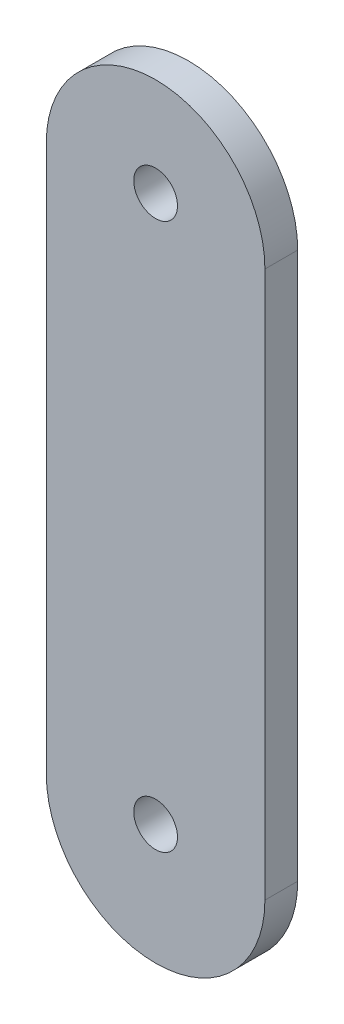
ISO-10303-21;
HEADER;
FILE_DESCRIPTION(('STEP AP214'),'2;1');
FILE_NAME('part.step','',(''),(''),'','','');
FILE_SCHEMA(('AUTOMOTIVE_DESIGN { 1 0 10303 214 1 1 1 1 }'));
ENDSEC;
DATA;
#1=APPLICATION_CONTEXT('core data for automotive mechanical design processes');
#2=APPLICATION_PROTOCOL_DEFINITION('international standard','automotive_design',2000,#1);
#3=PRODUCT_CONTEXT('',#1,'mechanical');
#4=PRODUCT('Part','Part','',(#3));
#5=PRODUCT_RELATED_PRODUCT_CATEGORY('part','',(#4));
#6=PRODUCT_DEFINITION_FORMATION('','',#4);
#7=PRODUCT_DEFINITION_CONTEXT('part definition',#1,'design');
#8=PRODUCT_DEFINITION('design','',#6,#7);
#9=PRODUCT_DEFINITION_SHAPE('','',#8);
#10=(LENGTH_UNIT() NAMED_UNIT(*) SI_UNIT(.MILLI.,.METRE.));
#11=(NAMED_UNIT(*) PLANE_ANGLE_UNIT() SI_UNIT($,.RADIAN.));
#12=(NAMED_UNIT(*) SI_UNIT($,.STERADIAN.) SOLID_ANGLE_UNIT());
#13=UNCERTAINTY_MEASURE_WITH_UNIT(LENGTH_MEASURE(1.E-05),#10,'distance_accuracy_value','');
#14=(GEOMETRIC_REPRESENTATION_CONTEXT(3) GLOBAL_UNCERTAINTY_ASSIGNED_CONTEXT((#13)) GLOBAL_UNIT_ASSIGNED_CONTEXT((#10,
#11,#12)) REPRESENTATION_CONTEXT('',''));
#15=CARTESIAN_POINT('',(0.,0.,0.));
#16=DIRECTION('',(0.,0.,1.));
#17=DIRECTION('',(1.,0.,0.));
#18=AXIS2_PLACEMENT_3D('',#15,#16,#17);
#19=CARTESIAN_POINT('',(0.,25.,3.));
#20=DIRECTION('',(0.,0.,1.));
#21=DIRECTION('',(1.,0.,0.));
#22=AXIS2_PLACEMENT_3D('',#19,#20,#21);
#23=PLANE('',#22);
#24=CARTESIAN_POINT('',(0.,26.,3.));
#25=DIRECTION('',(0.,0.,1.));
#26=DIRECTION('',(1.,0.,0.));
#27=AXIS2_PLACEMENT_3D('',#24,#25,#26);
#28=CIRCLE('',#27,2.00000000000001);
#29=CARTESIAN_POINT('',(2.00000000000001,26.,3.));
#30=VERTEX_POINT('',#29);
#31=EDGE_CURVE('E108',#30,#30,#28,.T.);
#32=ORIENTED_EDGE('',*,*,#31,.F.);
#33=EDGE_LOOP('',(#32));
#34=FACE_BOUND('',#33,.T.);
#35=CARTESIAN_POINT('',(0.,25.,3.));
#36=DIRECTION('',(0.,0.,1.));
#37=DIRECTION('',(1.,0.,0.));
#38=AXIS2_PLACEMENT_3D('',#35,#36,#37);
#39=CIRCLE('',#38,9.99999999999999);
#40=CARTESIAN_POINT('',(9.99999999999998,25.,3.));
#41=VERTEX_POINT('',#40);
#42=CARTESIAN_POINT('',(-10.,25.,3.));
#43=VERTEX_POINT('',#42);
#44=EDGE_CURVE('E93',#41,#43,#39,.T.);
#45=ORIENTED_EDGE('',*,*,#44,.T.);
#46=DIRECTION('',(0.,-1.,0.));
#47=VECTOR('',#46,1.);
#48=CARTESIAN_POINT('',(-10.,25.,3.));
#49=LINE('',#48,#47);
#50=CARTESIAN_POINT('',(-9.99999999999998,-25.,3.));
#51=VERTEX_POINT('',#50);
#52=EDGE_CURVE('E88',#43,#51,#49,.T.);
#53=ORIENTED_EDGE('',*,*,#52,.T.);
#54=CARTESIAN_POINT('',(0.,-25.,3.));
#55=DIRECTION('',(0.,0.,1.));
#56=DIRECTION('',(1.,0.,0.));
#57=AXIS2_PLACEMENT_3D('',#54,#55,#56);
#58=CIRCLE('',#57,9.99999999999999);
#59=CARTESIAN_POINT('',(10.,-25.,3.));
#60=VERTEX_POINT('',#59);
#61=EDGE_CURVE('E91',#51,#60,#58,.T.);
#62=ORIENTED_EDGE('',*,*,#61,.T.);
#63=DIRECTION('',(0.,1.,0.));
#64=VECTOR('',#63,1.);
#65=CARTESIAN_POINT('',(9.99999999999998,25.,3.));
#66=LINE('',#65,#64);
#67=EDGE_CURVE('E58',#60,#41,#66,.T.);
#68=ORIENTED_EDGE('',*,*,#67,.T.);
#69=EDGE_LOOP('',(#45,#53,#62,#68));
#70=FACE_BOUND('',#69,.T.);
#71=CARTESIAN_POINT('',(0.,-24.,3.));
#72=DIRECTION('',(0.,0.,1.));
#73=DIRECTION('',(1.,0.,0.));
#74=AXIS2_PLACEMENT_3D('',#71,#72,#73);
#75=CIRCLE('',#74,2.00000000000001);
#76=CARTESIAN_POINT('',(2.00000000000001,-24.,3.));
#77=VERTEX_POINT('',#76);
#78=EDGE_CURVE('E123',#77,#77,#75,.T.);
#79=ORIENTED_EDGE('',*,*,#78,.F.);
#80=EDGE_LOOP('',(#79));
#81=FACE_BOUND('',#80,.T.);
#82=ADVANCED_FACE('F41',(#34,#70,#81),#23,.T.);
#83=CARTESIAN_POINT('',(0.,25.,0.));
#84=DIRECTION('',(0.,0.,1.));
#85=DIRECTION('',(1.,0.,0.));
#86=AXIS2_PLACEMENT_3D('',#83,#84,#85);
#87=PLANE('',#86);
#88=CARTESIAN_POINT('',(0.,25.,0.));
#89=DIRECTION('',(0.,0.,1.));
#90=DIRECTION('',(1.,0.,0.));
#91=AXIS2_PLACEMENT_3D('',#88,#89,#90);
#92=CIRCLE('',#91,9.99999999999999);
#93=CARTESIAN_POINT('',(9.99999999999998,25.,0.));
#94=VERTEX_POINT('',#93);
#95=CARTESIAN_POINT('',(-10.,25.,0.));
#96=VERTEX_POINT('',#95);
#97=EDGE_CURVE('E105',#94,#96,#92,.T.);
#98=ORIENTED_EDGE('',*,*,#97,.F.);
#99=DIRECTION('',(0.,1.,0.));
#100=VECTOR('',#99,1.);
#101=CARTESIAN_POINT('',(9.99999999999998,25.,0.));
#102=LINE('',#101,#100);
#103=CARTESIAN_POINT('',(10.,-25.,0.));
#104=VERTEX_POINT('',#103);
#105=EDGE_CURVE('E81',#104,#94,#102,.T.);
#106=ORIENTED_EDGE('',*,*,#105,.F.);
#107=CARTESIAN_POINT('',(0.,-25.,0.));
#108=DIRECTION('',(0.,0.,1.));
#109=DIRECTION('',(1.,0.,0.));
#110=AXIS2_PLACEMENT_3D('',#107,#108,#109);
#111=CIRCLE('',#110,9.99999999999999);
#112=CARTESIAN_POINT('',(-9.99999999999998,-25.,0.));
#113=VERTEX_POINT('',#112);
#114=EDGE_CURVE('E75',#113,#104,#111,.T.);
#115=ORIENTED_EDGE('',*,*,#114,.F.);
#116=DIRECTION('',(0.,-1.,0.));
#117=VECTOR('',#116,1.);
#118=CARTESIAN_POINT('',(-10.,25.,0.));
#119=LINE('',#118,#117);
#120=EDGE_CURVE('E97',#96,#113,#119,.T.);
#121=ORIENTED_EDGE('',*,*,#120,.F.);
#122=EDGE_LOOP('',(#98,#106,#115,#121));
#123=FACE_BOUND('',#122,.T.);
#124=CARTESIAN_POINT('',(0.,26.,0.));
#125=DIRECTION('',(0.,0.,1.));
#126=DIRECTION('',(1.,0.,0.));
#127=AXIS2_PLACEMENT_3D('',#124,#125,#126);
#128=CIRCLE('',#127,2.00000000000001);
#129=CARTESIAN_POINT('',(2.00000000000001,26.,0.));
#130=VERTEX_POINT('',#129);
#131=EDGE_CURVE('E120',#130,#130,#128,.T.);
#132=ORIENTED_EDGE('',*,*,#131,.T.);
#133=EDGE_LOOP('',(#132));
#134=FACE_BOUND('',#133,.T.);
#135=CARTESIAN_POINT('',(0.,-24.,0.));
#136=DIRECTION('',(0.,0.,1.));
#137=DIRECTION('',(1.,0.,0.));
#138=AXIS2_PLACEMENT_3D('',#135,#136,#137);
#139=CIRCLE('',#138,2.00000000000001);
#140=CARTESIAN_POINT('',(2.00000000000001,-24.,0.));
#141=VERTEX_POINT('',#140);
#142=EDGE_CURVE('E126',#141,#141,#139,.T.);
#143=ORIENTED_EDGE('',*,*,#142,.T.);
#144=EDGE_LOOP('',(#143));
#145=FACE_BOUND('',#144,.T.);
#146=ADVANCED_FACE('F116',(#123,#134,#145),#87,.F.);
#147=CARTESIAN_POINT('',(0.,25.,3.));
#148=DIRECTION('',(0.,0.,-1.));
#149=DIRECTION('',(-1.,0.,0.));
#150=AXIS2_PLACEMENT_3D('',#147,#148,#149);
#151=CYLINDRICAL_SURFACE('',#150,9.99999999999999);
#152=ORIENTED_EDGE('',*,*,#97,.T.);
#153=DIRECTION('',(0.,0.,-1.));
#154=VECTOR('',#153,1.);
#155=CARTESIAN_POINT('',(-10.,25.,3.));
#156=LINE('',#155,#154);
#157=EDGE_CURVE('E11',#43,#96,#156,.T.);
#158=ORIENTED_EDGE('',*,*,#157,.F.);
#159=ORIENTED_EDGE('',*,*,#44,.F.);
#160=DIRECTION('',(0.,0.,-1.));
#161=VECTOR('',#160,1.);
#162=CARTESIAN_POINT('',(9.99999999999998,25.,3.));
#163=LINE('',#162,#161);
#164=EDGE_CURVE('E101',#41,#94,#163,.T.);
#165=ORIENTED_EDGE('',*,*,#164,.T.);
#166=EDGE_LOOP('',(#152,#158,#159,#165));
#167=FACE_BOUND('',#166,.T.);
#168=ADVANCED_FACE('F43',(#167),#151,.T.);
#169=CARTESIAN_POINT('',(-10.,25.,3.));
#170=DIRECTION('',(1.,0.,0.));
#171=DIRECTION('',(0.,1.,0.));
#172=AXIS2_PLACEMENT_3D('',#169,#170,#171);
#173=PLANE('',#172);
#174=ORIENTED_EDGE('',*,*,#120,.T.);
#175=DIRECTION('',(0.,0.,-1.));
#176=VECTOR('',#175,1.);
#177=CARTESIAN_POINT('',(-9.99999999999998,-25.,3.));
#178=LINE('',#177,#176);
#179=EDGE_CURVE('E50',#51,#113,#178,.T.);
#180=ORIENTED_EDGE('',*,*,#179,.F.);
#181=ORIENTED_EDGE('',*,*,#52,.F.);
#182=ORIENTED_EDGE('',*,*,#157,.T.);
#183=EDGE_LOOP('',(#174,#180,#181,#182));
#184=FACE_BOUND('',#183,.T.);
#185=ADVANCED_FACE('F96',(#184),#173,.F.);
#186=CARTESIAN_POINT('',(0.,-25.,3.));
#187=DIRECTION('',(0.,0.,-1.));
#188=DIRECTION('',(-1.,0.,0.));
#189=AXIS2_PLACEMENT_3D('',#186,#187,#188);
#190=CYLINDRICAL_SURFACE('',#189,9.99999999999999);
#191=ORIENTED_EDGE('',*,*,#114,.T.);
#192=DIRECTION('',(0.,0.,-1.));
#193=VECTOR('',#192,1.);
#194=CARTESIAN_POINT('',(10.,-25.,3.));
#195=LINE('',#194,#193);
#196=EDGE_CURVE('E98',#60,#104,#195,.T.);
#197=ORIENTED_EDGE('',*,*,#196,.F.);
#198=ORIENTED_EDGE('',*,*,#61,.F.);
#199=ORIENTED_EDGE('',*,*,#179,.T.);
#200=EDGE_LOOP('',(#191,#197,#198,#199));
#201=FACE_BOUND('',#200,.T.);
#202=ADVANCED_FACE('F99',(#201),#190,.T.);
#203=CARTESIAN_POINT('',(9.99999999999998,25.,3.));
#204=DIRECTION('',(-1.,0.,0.));
#205=DIRECTION('',(0.,-1.,0.));
#206=AXIS2_PLACEMENT_3D('',#203,#204,#205);
#207=PLANE('',#206);
#208=ORIENTED_EDGE('',*,*,#105,.T.);
#209=ORIENTED_EDGE('',*,*,#164,.F.);
#210=ORIENTED_EDGE('',*,*,#67,.F.);
#211=ORIENTED_EDGE('',*,*,#196,.T.);
#212=EDGE_LOOP('',(#208,#209,#210,#211));
#213=FACE_BOUND('',#212,.T.);
#214=ADVANCED_FACE('F113',(#213),#207,.F.);
#215=CARTESIAN_POINT('',(0.,26.,3.));
#216=DIRECTION('',(0.,0.,-1.));
#217=DIRECTION('',(-1.,0.,0.));
#218=AXIS2_PLACEMENT_3D('',#215,#216,#217);
#219=CYLINDRICAL_SURFACE('',#218,2.00000000000001);
#220=ORIENTED_EDGE('',*,*,#31,.T.);
#221=EDGE_LOOP('',(#220));
#222=FACE_BOUND('',#221,.T.);
#223=ORIENTED_EDGE('',*,*,#131,.F.);
#224=EDGE_LOOP('',(#223));
#225=FACE_BOUND('',#224,.T.);
#226=ADVANCED_FACE('F143',(#222,#225),#219,.F.);
#227=CARTESIAN_POINT('',(0.,-24.,3.));
#228=DIRECTION('',(0.,0.,-1.));
#229=DIRECTION('',(-1.,0.,0.));
#230=AXIS2_PLACEMENT_3D('',#227,#228,#229);
#231=CYLINDRICAL_SURFACE('',#230,2.00000000000001);
#232=ORIENTED_EDGE('',*,*,#78,.T.);
#233=EDGE_LOOP('',(#232));
#234=FACE_BOUND('',#233,.T.);
#235=ORIENTED_EDGE('',*,*,#142,.F.);
#236=EDGE_LOOP('',(#235));
#237=FACE_BOUND('',#236,.T.);
#238=ADVANCED_FACE('F132',(#234,#237),#231,.F.);
#239=CLOSED_SHELL('',(#82,#146,#168,#185,#202,#214,#226,#238));
#240=MANIFOLD_SOLID_BREP('B2',#239);
#241=ADVANCED_BREP_SHAPE_REPRESENTATION('',(#18,#240),#14);
#242=SHAPE_DEFINITION_REPRESENTATION(#9,#241);
ENDSEC;
END-ISO-10303-21;
